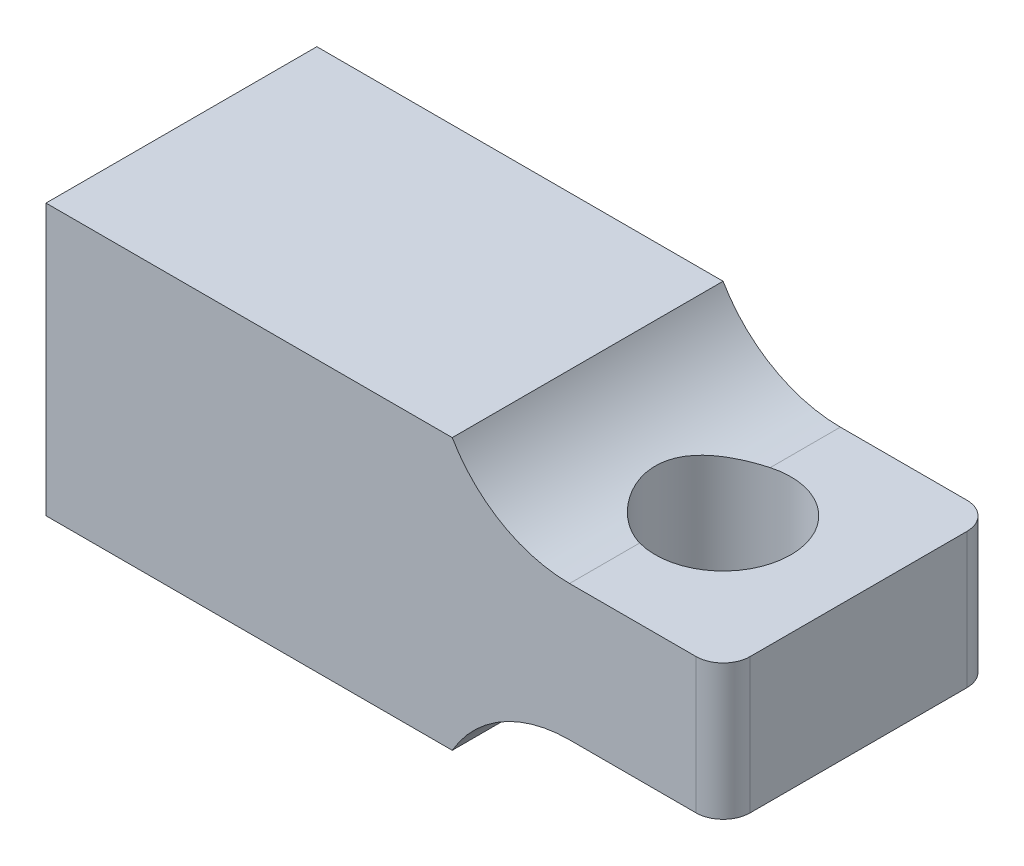
ISO-10303-21;
HEADER;
FILE_DESCRIPTION(('STEP AP214'),'2;1');
FILE_NAME('part.step','',(''),(''),'','','');
FILE_SCHEMA(('AUTOMOTIVE_DESIGN { 1 0 10303 214 1 1 1 1 }'));
ENDSEC;
DATA;
#1=APPLICATION_CONTEXT('core data for automotive mechanical design processes');
#2=APPLICATION_PROTOCOL_DEFINITION('international standard','automotive_design',2000,#1);
#3=PRODUCT_CONTEXT('',#1,'mechanical');
#4=PRODUCT('Part','Part','',(#3));
#5=PRODUCT_RELATED_PRODUCT_CATEGORY('part','',(#4));
#6=PRODUCT_DEFINITION_FORMATION('','',#4);
#7=PRODUCT_DEFINITION_CONTEXT('part definition',#1,'design');
#8=PRODUCT_DEFINITION('design','',#6,#7);
#9=PRODUCT_DEFINITION_SHAPE('','',#8);
#10=(LENGTH_UNIT() NAMED_UNIT(*) SI_UNIT(.MILLI.,.METRE.));
#11=(NAMED_UNIT(*) PLANE_ANGLE_UNIT() SI_UNIT($,.RADIAN.));
#12=(NAMED_UNIT(*) SI_UNIT($,.STERADIAN.) SOLID_ANGLE_UNIT());
#13=UNCERTAINTY_MEASURE_WITH_UNIT(LENGTH_MEASURE(1.E-05),#10,'distance_accuracy_value','');
#14=(GEOMETRIC_REPRESENTATION_CONTEXT(3) GLOBAL_UNCERTAINTY_ASSIGNED_CONTEXT((#13)) GLOBAL_UNIT_ASSIGNED_CONTEXT((#10,
#11,#12)) REPRESENTATION_CONTEXT('',''));
#15=CARTESIAN_POINT('',(0.,0.,0.));
#16=DIRECTION('',(0.,0.,1.));
#17=DIRECTION('',(1.,0.,0.));
#18=AXIS2_PLACEMENT_3D('',#15,#16,#17);
#19=CARTESIAN_POINT('',(0.,6.35,0.));
#20=DIRECTION('',(1.,0.,0.));
#21=DIRECTION('',(0.,0.,-1.));
#22=AXIS2_PLACEMENT_3D('',#19,#20,#21);
#23=PLANE('',#22);
#24=CARTESIAN_POINT('',(0.,0.,-6.35));
#25=DIRECTION('',(-1.,0.,0.));
#26=DIRECTION('',(0.,0.,1.));
#27=AXIS2_PLACEMENT_3D('',#24,#25,#26);
#28=CIRCLE('',#27,2.55269999999999);
#29=CARTESIAN_POINT('',(0.,0.,-3.79730000000001));
#30=VERTEX_POINT('',#29);
#31=EDGE_CURVE('E183',#30,#30,#28,.T.);
#32=ORIENTED_EDGE('',*,*,#31,.F.);
#33=EDGE_LOOP('',(#32));
#34=FACE_BOUND('',#33,.T.);
#35=DIRECTION('',(0.,0.,1.));
#36=VECTOR('',#35,1.);
#37=CARTESIAN_POINT('',(0.,-6.35,0.));
#38=LINE('',#37,#36);
#39=CARTESIAN_POINT('',(0.,-6.35,-12.7));
#40=VERTEX_POINT('',#39);
#41=CARTESIAN_POINT('',(0.,-6.35,0.));
#42=VERTEX_POINT('',#41);
#43=EDGE_CURVE('E152',#40,#42,#38,.T.);
#44=ORIENTED_EDGE('',*,*,#43,.T.);
#45=DIRECTION('',(0.,-1.,0.));
#46=VECTOR('',#45,1.);
#47=CARTESIAN_POINT('',(0.,6.35,0.));
#48=LINE('',#47,#46);
#49=CARTESIAN_POINT('',(0.,6.35,0.));
#50=VERTEX_POINT('',#49);
#51=EDGE_CURVE('E200',#50,#42,#48,.T.);
#52=ORIENTED_EDGE('',*,*,#51,.F.);
#53=DIRECTION('',(0.,0.,1.));
#54=VECTOR('',#53,1.);
#55=CARTESIAN_POINT('',(0.,6.35,0.));
#56=LINE('',#55,#54);
#57=CARTESIAN_POINT('',(0.,6.35,-12.7));
#58=VERTEX_POINT('',#57);
#59=EDGE_CURVE('E153',#58,#50,#56,.T.);
#60=ORIENTED_EDGE('',*,*,#59,.F.);
#61=DIRECTION('',(0.,-1.,0.));
#62=VECTOR('',#61,1.);
#63=CARTESIAN_POINT('',(0.,6.35,-12.7));
#64=LINE('',#63,#62);
#65=EDGE_CURVE('E196',#58,#40,#64,.T.);
#66=ORIENTED_EDGE('',*,*,#65,.T.);
#67=EDGE_LOOP('',(#44,#52,#60,#66));
#68=FACE_BOUND('',#67,.T.);
#69=ADVANCED_FACE('F35',(#34,#68),#23,.F.);
#70=CARTESIAN_POINT('',(0.,6.35,0.));
#71=DIRECTION('',(0.,0.,-1.));
#72=DIRECTION('',(-1.,0.,0.));
#73=AXIS2_PLACEMENT_3D('',#70,#71,#72);
#74=PLANE('',#73);
#75=DIRECTION('',(-1.,0.,0.));
#76=VECTOR('',#75,1.);
#77=CARTESIAN_POINT('',(31.75,-3.175,0.));
#78=LINE('',#77,#76);
#79=CARTESIAN_POINT('',(30.48,-3.175,0.));
#80=VERTEX_POINT('',#79);
#81=CARTESIAN_POINT('',(24.5492613140312,-3.175,0.));
#82=VERTEX_POINT('',#81);
#83=EDGE_CURVE('E170',#80,#82,#78,.T.);
#84=ORIENTED_EDGE('',*,*,#83,.F.);
#85=DIRECTION('',(0.,-1.,0.));
#86=VECTOR('',#85,1.);
#87=CARTESIAN_POINT('',(30.48,6.35,0.));
#88=LINE('',#87,#86);
#89=CARTESIAN_POINT('',(30.48,3.175,0.));
#90=VERTEX_POINT('',#89);
#91=EDGE_CURVE('E58',#80,#90,#88,.F.);
#92=ORIENTED_EDGE('',*,*,#91,.T.);
#93=DIRECTION('',(1.,0.,0.));
#94=VECTOR('',#93,1.);
#95=CARTESIAN_POINT('',(31.75,3.175,0.));
#96=LINE('',#95,#94);
#97=CARTESIAN_POINT('',(24.5492613140312,3.175,0.));
#98=VERTEX_POINT('',#97);
#99=EDGE_CURVE('E165',#98,#90,#96,.T.);
#100=ORIENTED_EDGE('',*,*,#99,.F.);
#101=CARTESIAN_POINT('',(24.5492613140312,9.525,0.));
#102=DIRECTION('',(0.,0.,-1.));
#103=DIRECTION('',(-1.,0.,0.));
#104=AXIS2_PLACEMENT_3D('',#101,#102,#103);
#105=CIRCLE('',#104,6.35);
#106=CARTESIAN_POINT('',(19.05,6.35,0.));
#107=VERTEX_POINT('',#106);
#108=EDGE_CURVE('E221',#98,#107,#105,.T.);
#109=ORIENTED_EDGE('',*,*,#108,.T.);
#110=DIRECTION('',(1.,0.,0.));
#111=VECTOR('',#110,1.);
#112=CARTESIAN_POINT('',(0.,6.35,0.));
#113=LINE('',#112,#111);
#114=EDGE_CURVE('E191',#50,#107,#113,.T.);
#115=ORIENTED_EDGE('',*,*,#114,.F.);
#116=ORIENTED_EDGE('',*,*,#51,.T.);
#117=DIRECTION('',(1.,0.,0.));
#118=VECTOR('',#117,1.);
#119=CARTESIAN_POINT('',(0.,-6.35,0.));
#120=LINE('',#119,#118);
#121=CARTESIAN_POINT('',(19.05,-6.35,0.));
#122=VERTEX_POINT('',#121);
#123=EDGE_CURVE('E154',#42,#122,#120,.T.);
#124=ORIENTED_EDGE('',*,*,#123,.T.);
#125=CARTESIAN_POINT('',(24.5492613140312,-9.525,0.));
#126=DIRECTION('',(0.,0.,-1.));
#127=DIRECTION('',(-1.,0.,0.));
#128=AXIS2_PLACEMENT_3D('',#125,#126,#127);
#129=CIRCLE('',#128,6.35);
#130=EDGE_CURVE('E160',#122,#82,#129,.T.);
#131=ORIENTED_EDGE('',*,*,#130,.T.);
#132=EDGE_LOOP('',(#84,#92,#100,#109,#115,#116,#124,#131));
#133=FACE_BOUND('',#132,.T.);
#134=ADVANCED_FACE('F262',(#133),#74,.F.);
#135=CARTESIAN_POINT('',(31.75,6.35,0.));
#136=DIRECTION('',(-1.,0.,0.));
#137=DIRECTION('',(0.,0.,1.));
#138=AXIS2_PLACEMENT_3D('',#135,#136,#137);
#139=PLANE('',#138);
#140=DIRECTION('',(0.,0.,1.));
#141=VECTOR('',#140,1.);
#142=CARTESIAN_POINT('',(31.75,3.175,-12.7));
#143=LINE('',#142,#141);
#144=CARTESIAN_POINT('',(31.75,3.175,-11.43));
#145=VERTEX_POINT('',#144);
#146=CARTESIAN_POINT('',(31.75,3.175,-1.27));
#147=VERTEX_POINT('',#146);
#148=EDGE_CURVE('E177',#145,#147,#143,.T.);
#149=ORIENTED_EDGE('',*,*,#148,.T.);
#150=DIRECTION('',(0.,-1.,0.));
#151=VECTOR('',#150,1.);
#152=CARTESIAN_POINT('',(31.75,6.35,-1.27));
#153=LINE('',#152,#151);
#154=CARTESIAN_POINT('',(31.75,-3.175,-1.27));
#155=VERTEX_POINT('',#154);
#156=EDGE_CURVE('E245',#147,#155,#153,.T.);
#157=ORIENTED_EDGE('',*,*,#156,.T.);
#158=DIRECTION('',(0.,0.,1.));
#159=VECTOR('',#158,1.);
#160=CARTESIAN_POINT('',(31.75,-3.175,-12.7));
#161=LINE('',#160,#159);
#162=CARTESIAN_POINT('',(31.75,-3.175,-11.43));
#163=VERTEX_POINT('',#162);
#164=EDGE_CURVE('E162',#163,#155,#161,.T.);
#165=ORIENTED_EDGE('',*,*,#164,.F.);
#166=DIRECTION('',(0.,-1.,0.));
#167=VECTOR('',#166,1.);
#168=CARTESIAN_POINT('',(31.75,6.35,-11.43));
#169=LINE('',#168,#167);
#170=EDGE_CURVE('E142',#163,#145,#169,.F.);
#171=ORIENTED_EDGE('',*,*,#170,.T.);
#172=EDGE_LOOP('',(#149,#157,#165,#171));
#173=FACE_BOUND('',#172,.T.);
#174=ADVANCED_FACE('F258',(#173),#139,.F.);
#175=CARTESIAN_POINT('',(0.,6.35,-12.7));
#176=DIRECTION('',(0.,0.,1.));
#177=DIRECTION('',(1.,0.,0.));
#178=AXIS2_PLACEMENT_3D('',#175,#176,#177);
#179=PLANE('',#178);
#180=DIRECTION('',(1.,0.,0.));
#181=VECTOR('',#180,1.);
#182=CARTESIAN_POINT('',(31.75,3.175,-12.7));
#183=LINE('',#182,#181);
#184=CARTESIAN_POINT('',(24.5492613140312,3.175,-12.7));
#185=VERTEX_POINT('',#184);
#186=CARTESIAN_POINT('',(30.48,3.175,-12.7));
#187=VERTEX_POINT('',#186);
#188=EDGE_CURVE('E173',#185,#187,#183,.T.);
#189=ORIENTED_EDGE('',*,*,#188,.T.);
#190=DIRECTION('',(0.,-1.,0.));
#191=VECTOR('',#190,1.);
#192=CARTESIAN_POINT('',(30.48,6.35,-12.7));
#193=LINE('',#192,#191);
#194=CARTESIAN_POINT('',(30.48,-3.175,-12.7));
#195=VERTEX_POINT('',#194);
#196=EDGE_CURVE('E11',#187,#195,#193,.T.);
#197=ORIENTED_EDGE('',*,*,#196,.T.);
#198=DIRECTION('',(-1.,0.,0.));
#199=VECTOR('',#198,1.);
#200=CARTESIAN_POINT('',(31.75,-3.175,-12.7));
#201=LINE('',#200,#199);
#202=CARTESIAN_POINT('',(24.5492613140312,-3.175,-12.7));
#203=VERTEX_POINT('',#202);
#204=EDGE_CURVE('E137',#195,#203,#201,.T.);
#205=ORIENTED_EDGE('',*,*,#204,.T.);
#206=CARTESIAN_POINT('',(24.5492613140312,-9.525,-12.7));
#207=DIRECTION('',(0.,0.,1.));
#208=DIRECTION('',(1.,0.,0.));
#209=AXIS2_PLACEMENT_3D('',#206,#207,#208);
#210=CIRCLE('',#209,6.35);
#211=CARTESIAN_POINT('',(19.05,-6.35,-12.7));
#212=VERTEX_POINT('',#211);
#213=EDGE_CURVE('E130',#203,#212,#210,.T.);
#214=ORIENTED_EDGE('',*,*,#213,.T.);
#215=DIRECTION('',(-1.,0.,0.));
#216=VECTOR('',#215,1.);
#217=CARTESIAN_POINT('',(0.,-6.35,-12.7));
#218=LINE('',#217,#216);
#219=EDGE_CURVE('E134',#212,#40,#218,.T.);
#220=ORIENTED_EDGE('',*,*,#219,.T.);
#221=ORIENTED_EDGE('',*,*,#65,.F.);
#222=DIRECTION('',(-1.,0.,0.));
#223=VECTOR('',#222,1.);
#224=CARTESIAN_POINT('',(0.,6.35,-12.7));
#225=LINE('',#224,#223);
#226=CARTESIAN_POINT('',(19.05,6.35,-12.7));
#227=VERTEX_POINT('',#226);
#228=EDGE_CURVE('E194',#227,#58,#225,.T.);
#229=ORIENTED_EDGE('',*,*,#228,.F.);
#230=CARTESIAN_POINT('',(24.5492613140312,9.525,-12.7));
#231=DIRECTION('',(0.,0.,1.));
#232=DIRECTION('',(1.,0.,0.));
#233=AXIS2_PLACEMENT_3D('',#230,#231,#232);
#234=CIRCLE('',#233,6.35);
#235=EDGE_CURVE('E263',#227,#185,#234,.T.);
#236=ORIENTED_EDGE('',*,*,#235,.T.);
#237=EDGE_LOOP('',(#189,#197,#205,#214,#220,#221,#229,#236));
#238=FACE_BOUND('',#237,.T.);
#239=ADVANCED_FACE('F132',(#238),#179,.F.);
#240=CARTESIAN_POINT('',(0.,6.35,0.));
#241=DIRECTION('',(0.,-1.,0.));
#242=DIRECTION('',(0.,0.,-1.));
#243=AXIS2_PLACEMENT_3D('',#240,#241,#242);
#244=PLANE('',#243);
#245=ORIENTED_EDGE('',*,*,#114,.T.);
#246=DIRECTION('',(0.,0.,1.));
#247=VECTOR('',#246,1.);
#248=CARTESIAN_POINT('',(19.05,6.35,-12.7));
#249=LINE('',#248,#247);
#250=EDGE_CURVE('E175',#227,#107,#249,.T.);
#251=ORIENTED_EDGE('',*,*,#250,.F.);
#252=ORIENTED_EDGE('',*,*,#228,.T.);
#253=ORIENTED_EDGE('',*,*,#59,.T.);
#254=EDGE_LOOP('',(#245,#251,#252,#253));
#255=FACE_BOUND('',#254,.T.);
#256=ADVANCED_FACE('F278',(#255),#244,.F.);
#257=CARTESIAN_POINT('',(0.,-6.35,0.));
#258=DIRECTION('',(0.,-1.,0.));
#259=DIRECTION('',(0.,0.,-1.));
#260=AXIS2_PLACEMENT_3D('',#257,#258,#259);
#261=PLANE('',#260);
#262=DIRECTION('',(0.,0.,1.));
#263=VECTOR('',#262,1.);
#264=CARTESIAN_POINT('',(19.05,-6.35,-12.7));
#265=LINE('',#264,#263);
#266=EDGE_CURVE('E149',#212,#122,#265,.T.);
#267=ORIENTED_EDGE('',*,*,#266,.T.);
#268=ORIENTED_EDGE('',*,*,#123,.F.);
#269=ORIENTED_EDGE('',*,*,#43,.F.);
#270=ORIENTED_EDGE('',*,*,#219,.F.);
#271=EDGE_LOOP('',(#267,#268,#269,#270));
#272=FACE_BOUND('',#271,.T.);
#273=ADVANCED_FACE('F148',(#272),#261,.T.);
#274=CARTESIAN_POINT('',(25.4,6.35,-6.35));
#275=DIRECTION('',(0.,1.,0.));
#276=DIRECTION('',(0.,0.,1.));
#277=AXIS2_PLACEMENT_3D('',#274,#275,#276);
#278=CYLINDRICAL_SURFACE('',#277,3.175);
#279=CARTESIAN_POINT('',(25.4,-3.175,-6.35));
#280=DIRECTION('',(0.,1.,0.));
#281=DIRECTION('',(-1.,0.,0.));
#282=AXIS2_PLACEMENT_3D('',#279,#280,#281);
#283=CIRCLE('',#282,3.175);
#284=CARTESIAN_POINT('',(24.5492613140312,-3.175,-9.40889991470725));
#285=VERTEX_POINT('',#284);
#286=CARTESIAN_POINT('',(24.5492613140312,-3.175,-3.29110008529275));
#287=VERTEX_POINT('',#286);
#288=EDGE_CURVE('E161',#285,#287,#283,.F.);
#289=ORIENTED_EDGE('',*,*,#288,.T.);
#290=CARTESIAN_POINT('',(24.5492613140312,-3.175,-3.29110008529275));
#291=CARTESIAN_POINT('',(24.4660915377249,-3.17498737835902,-3.31421818629125));
#292=CARTESIAN_POINT('',(24.3838884335345,-3.17663365343391,-3.34074714025521));
#293=CARTESIAN_POINT('',(24.222050979392,-3.18292262605166,-3.40034371766706));
#294=CARTESIAN_POINT('',(24.1424153413064,-3.18756379565462,-3.43340800094694));
#295=CARTESIAN_POINT('',(23.9865530106745,-3.19949955784596,-3.5056814797863));
#296=CARTESIAN_POINT('',(23.9103147264998,-3.20678420365704,-3.54486733061761));
#297=CARTESIAN_POINT('',(23.7614496675442,-3.22361354651064,-3.62913574616115));
#298=CARTESIAN_POINT('',(23.6888232698451,-3.23315847893077,-3.67421892477957));
#299=CARTESIAN_POINT('',(23.4772828030649,-3.26452045317134,-3.81766430863597));
#300=CARTESIAN_POINT('',(23.3443238076043,-3.28909771809974,-3.92440131353114));
#301=CARTESIAN_POINT('',(23.0974719216235,-3.3418925656655,-4.15731375756623));
#302=CARTESIAN_POINT('',(22.9835989371624,-3.37011389531052,-4.28350923116358));
#303=CARTESIAN_POINT('',(22.7720010550618,-3.42774754896076,-4.55947084311855));
#304=CARTESIAN_POINT('',(22.6754175217717,-3.45714588248046,-4.71011908300886));
#305=CARTESIAN_POINT('',(22.5086363554259,-3.51117648569634,-5.02615873893508));
#306=CARTESIAN_POINT('',(22.4384335918262,-3.53580968166599,-5.19154728052186));
#307=CARTESIAN_POINT('',(22.3267705226977,-3.57633663390289,-5.53266459837418));
#308=CARTESIAN_POINT('',(22.2852819492299,-3.59223898213241,-5.70838301982277));
#309=CARTESIAN_POINT('',(22.232701178686,-3.61256545829925,-6.06492174518888));
#310=CARTESIAN_POINT('',(22.2215920967716,-3.61699596218341,-6.24573915861386));
#311=CARTESIAN_POINT('',(22.2299531729928,-3.61371446815001,-6.59481282875962));
#312=CARTESIAN_POINT('',(22.2474955231552,-3.60676789001974,-6.76312641945819));
#313=CARTESIAN_POINT('',(22.308858423148,-3.58326989836394,-7.09419115078008));
#314=CARTESIAN_POINT('',(22.3526830267299,-3.56671700318121,-7.25694142922906));
#315=CARTESIAN_POINT('',(22.465188810223,-3.52644274976279,-7.5729982057152));
#316=CARTESIAN_POINT('',(22.5339222074891,-3.50270634980953,-7.72628406712932));
#317=CARTESIAN_POINT('',(22.6943181734342,-3.45138875122633,-8.01969603132678));
#318=CARTESIAN_POINT('',(22.7859918460961,-3.42380569353559,-8.15981571586016));
#319=CARTESIAN_POINT('',(22.9969325031502,-3.36663245872795,-8.43268685695122));
#320=CARTESIAN_POINT('',(23.1176257687448,-3.33703043625021,-8.56433419043174));
#321=CARTESIAN_POINT('',(23.3799143170688,-3.28216548810673,-8.80592691812841));
#322=CARTESIAN_POINT('',(23.5214915658434,-3.25689885901789,-8.91589084706252));
#323=CARTESIAN_POINT('',(23.7387905142293,-3.22656602623439,-9.05692650275346));
#324=CARTESIAN_POINT('',(23.8076995028921,-3.21805022818109,-9.09802813757241));
#325=CARTESIAN_POINT('',(23.9486133610222,-3.2030751999361,-9.17498438894505));
#326=CARTESIAN_POINT('',(24.0206177124472,-3.19661562712223,-9.21083987910836));
#327=CARTESIAN_POINT('',(24.1674714911162,-3.18605983380147,-9.27711502935492));
#328=CARTESIAN_POINT('',(24.2423276024495,-3.18196958270944,-9.30752082733599));
#329=CARTESIAN_POINT('',(24.3942600647104,-3.17643413760237,-9.36258361858818));
#330=CARTESIAN_POINT('',(24.4713374883042,-3.17499024400587,-9.38723778031839));
#331=CARTESIAN_POINT('',(24.5492613140312,-3.175,-9.40889991470725));
#332=B_SPLINE_CURVE_WITH_KNOTS('',3,(#290,#291,#292,#293,#294,#295,#296,#297,#298,#299,#300,
#301,#302,#303,#304,#305,#306,#307,#308,#309,#310,#311,#312,#313,#314,#315,#316,#317,#318,#319,
#320,#321,#322,#323,#324,#325,#326,#327,#328,#329,#330,#331),.UNSPECIFIED.,.F.,.F.,(4,2,2,2,2,2,
2,2,2,2,2,2,2,2,2,2,2,2,2,2,4),(0.,0.258853871429198,0.517575784692825,0.775334114991391,
1.03311929907173,1.54743156865345,2.06227695478651,2.60377926175566,3.14517620254124,
3.68603939926368,4.22660192454779,4.73226731311277,5.23801071512971,5.74482052011351,
6.25187611682297,6.79254338020317,7.33274646487418,7.57460330070347,7.81641981558596,
8.05884295730184,8.30138519370174),.UNSPECIFIED.);
#333=EDGE_CURVE('E143',#287,#285,#332,.T.);
#334=ORIENTED_EDGE('',*,*,#333,.T.);
#335=EDGE_LOOP('',(#289,#334));
#336=FACE_BOUND('',#335,.T.);
#337=CARTESIAN_POINT('',(25.4,3.175,-6.35));
#338=DIRECTION('',(0.,-1.,0.));
#339=DIRECTION('',(1.,0.,0.));
#340=AXIS2_PLACEMENT_3D('',#337,#338,#339);
#341=CIRCLE('',#340,3.175);
#342=CARTESIAN_POINT('',(24.5492613140312,3.175,-3.29110008529275));
#343=VERTEX_POINT('',#342);
#344=CARTESIAN_POINT('',(24.5492613140312,3.175,-9.40889991470725));
#345=VERTEX_POINT('',#344);
#346=EDGE_CURVE('E180',#343,#345,#341,.F.);
#347=ORIENTED_EDGE('',*,*,#346,.T.);
#348=CARTESIAN_POINT('',(24.5492613140312,3.175,-9.40889991470725));
#349=CARTESIAN_POINT('',(24.4660915377249,3.17498737835902,-9.38578181370875));
#350=CARTESIAN_POINT('',(24.3838884335345,3.17663365343391,-9.35925285974479));
#351=CARTESIAN_POINT('',(24.222050979392,3.18292262605165,-9.29965628233295));
#352=CARTESIAN_POINT('',(24.1424153413064,3.18756379565461,-9.26659199905307));
#353=CARTESIAN_POINT('',(23.9865530106745,3.19949955784596,-9.19431852021371));
#354=CARTESIAN_POINT('',(23.9103147264998,3.20678420365704,-9.15513266938239));
#355=CARTESIAN_POINT('',(23.7614496675442,3.22361354651063,-9.07086425383886));
#356=CARTESIAN_POINT('',(23.6888232698451,3.23315847893077,-9.02578107522044));
#357=CARTESIAN_POINT('',(23.4772828030649,3.26452045317133,-8.88233569136403));
#358=CARTESIAN_POINT('',(23.3443238076043,3.28909771809974,-8.77559868646887));
#359=CARTESIAN_POINT('',(23.0974719216235,3.34189256566549,-8.54268624243378));
#360=CARTESIAN_POINT('',(22.9835989371624,3.37011389531051,-8.41649076883642));
#361=CARTESIAN_POINT('',(22.7720010550618,3.42774754896076,-8.14052915688145));
#362=CARTESIAN_POINT('',(22.6754175217717,3.45714588248046,-7.98988091699115));
#363=CARTESIAN_POINT('',(22.5086363554259,3.51117648569634,-7.67384126106493));
#364=CARTESIAN_POINT('',(22.4384335918262,3.53580968166599,-7.50845271947815));
#365=CARTESIAN_POINT('',(22.3267705226977,3.57633663390289,-7.16733540162583));
#366=CARTESIAN_POINT('',(22.2852819492299,3.5922389821324,-6.99161698017724));
#367=CARTESIAN_POINT('',(22.232701178686,3.61256545829925,-6.63507825481113));
#368=CARTESIAN_POINT('',(22.2215920967716,3.61699596218341,-6.45426084138615));
#369=CARTESIAN_POINT('',(22.2299531729928,3.61371446815,-6.10518717124039));
#370=CARTESIAN_POINT('',(22.2474955231552,3.60676789001974,-5.93687358054182));
#371=CARTESIAN_POINT('',(22.308858423148,3.58326989836394,-5.60580884921993));
#372=CARTESIAN_POINT('',(22.3526830267299,3.56671700318121,-5.44305857077095));
#373=CARTESIAN_POINT('',(22.465188810223,3.52644274976279,-5.12700179428481));
#374=CARTESIAN_POINT('',(22.5339222074891,3.50270634980953,-4.97371593287069));
#375=CARTESIAN_POINT('',(22.6943181734342,3.45138875122633,-4.68030396867322));
#376=CARTESIAN_POINT('',(22.7859918460961,3.42380569353559,-4.54018428413984));
#377=CARTESIAN_POINT('',(22.9969325031502,3.36663245872795,-4.26731314304879));
#378=CARTESIAN_POINT('',(23.1176257687448,3.33703043625021,-4.13566580956827));
#379=CARTESIAN_POINT('',(23.3799143170687,3.28216548810673,-3.8940730818716));
#380=CARTESIAN_POINT('',(23.5214915658434,3.25689885901789,-3.78410915293749));
#381=CARTESIAN_POINT('',(23.7387905142293,3.22656602623439,-3.64307349724654));
#382=CARTESIAN_POINT('',(23.8076995028921,3.21805022818109,-3.6019718624276));
#383=CARTESIAN_POINT('',(23.9486133610221,3.2030751999361,-3.52501561105495));
#384=CARTESIAN_POINT('',(24.0206177124472,3.19661562712222,-3.48916012089164));
#385=CARTESIAN_POINT('',(24.1674714911162,3.18605983380146,-3.42288497064508));
#386=CARTESIAN_POINT('',(24.2423276024495,3.18196958270944,-3.39247917266401));
#387=CARTESIAN_POINT('',(24.3942600647104,3.17643413760237,-3.33741638141181));
#388=CARTESIAN_POINT('',(24.4713374883042,3.17499024400586,-3.3127622196816));
#389=CARTESIAN_POINT('',(24.5492613140312,3.175,-3.29110008529275));
#390=B_SPLINE_CURVE_WITH_KNOTS('',3,(#348,#349,#350,#351,#352,#353,#354,#355,#356,#357,#358,
#359,#360,#361,#362,#363,#364,#365,#366,#367,#368,#369,#370,#371,#372,#373,#374,#375,#376,#377,
#378,#379,#380,#381,#382,#383,#384,#385,#386,#387,#388,#389),.UNSPECIFIED.,.F.,.F.,(4,2,2,2,2,2,
2,2,2,2,2,2,2,2,2,2,2,2,2,2,4),(0.,0.258853871429194,0.517575784692821,0.775334114991387,
1.03311929907173,1.54743156865345,2.0622769547865,2.60377926175566,3.14517620254123,
3.68603939926367,4.22660192454778,4.73226731311277,5.23801071512971,5.7448205201135,
6.25187611682296,6.79254338020317,7.33274646487418,7.57460330070346,7.81641981558596,
8.05884295730185,8.30138519370175),.UNSPECIFIED.);
#391=EDGE_CURVE('E214',#345,#343,#390,.T.);
#392=ORIENTED_EDGE('',*,*,#391,.T.);
#393=EDGE_LOOP('',(#347,#392));
#394=FACE_BOUND('',#393,.T.);
#395=ADVANCED_FACE('F223',(#336,#394),#278,.F.);
#396=CARTESIAN_POINT('',(12.7,0.,-6.35000000000001));
#397=DIRECTION('',(-1.,0.,0.));
#398=DIRECTION('',(0.,0.,1.));
#399=AXIS2_PLACEMENT_3D('',#396,#397,#398);
#400=CONICAL_SURFACE('',#399,2.5527,1.02974425867665);
#401=CARTESIAN_POINT('',(14.2338169021916,0.,-6.35000000000001));
#402=VERTEX_POINT('',#401);
#403=VERTEX_LOOP('',#402);
#404=FACE_BOUND('',#403,.T.);
#405=CARTESIAN_POINT('',(12.7,0.,-6.35000000000001));
#406=DIRECTION('',(-1.,0.,0.));
#407=DIRECTION('',(0.,0.,1.));
#408=AXIS2_PLACEMENT_3D('',#405,#406,#407);
#409=CIRCLE('',#408,2.5527);
#410=CARTESIAN_POINT('',(12.7,0.,-3.79730000000001));
#411=VERTEX_POINT('',#410);
#412=EDGE_CURVE('E186',#411,#411,#409,.T.);
#413=ORIENTED_EDGE('',*,*,#412,.T.);
#414=EDGE_LOOP('',(#413));
#415=FACE_BOUND('',#414,.T.);
#416=ADVANCED_FACE('F268',(#404,#415),#400,.F.);
#417=CARTESIAN_POINT('',(0.,0.,-6.35));
#418=DIRECTION('',(-1.,0.,0.));
#419=DIRECTION('',(0.,0.,1.));
#420=AXIS2_PLACEMENT_3D('',#417,#418,#419);
#421=CYLINDRICAL_SURFACE('',#420,2.55269999999999);
#422=ORIENTED_EDGE('',*,*,#412,.F.);
#423=EDGE_LOOP('',(#422));
#424=FACE_BOUND('',#423,.T.);
#425=ORIENTED_EDGE('',*,*,#31,.T.);
#426=EDGE_LOOP('',(#425));
#427=FACE_BOUND('',#426,.T.);
#428=ADVANCED_FACE('F288',(#424,#427),#421,.F.);
#429=CARTESIAN_POINT('',(31.75,3.175,-12.7));
#430=DIRECTION('',(0.,-1.,0.));
#431=DIRECTION('',(1.,0.,0.));
#432=AXIS2_PLACEMENT_3D('',#429,#430,#431);
#433=PLANE('',#432);
#434=ORIENTED_EDGE('',*,*,#99,.T.);
#435=CARTESIAN_POINT('',(30.48,3.175,-1.27));
#436=DIRECTION('',(0.,-1.,0.));
#437=DIRECTION('',(1.,0.,0.));
#438=AXIS2_PLACEMENT_3D('',#435,#436,#437);
#439=CIRCLE('',#438,1.27);
#440=EDGE_CURVE('E43',#90,#147,#439,.F.);
#441=ORIENTED_EDGE('',*,*,#440,.T.);
#442=ORIENTED_EDGE('',*,*,#148,.F.);
#443=CARTESIAN_POINT('',(30.48,3.175,-11.43));
#444=DIRECTION('',(0.,-1.,0.));
#445=DIRECTION('',(1.,0.,0.));
#446=AXIS2_PLACEMENT_3D('',#443,#444,#445);
#447=CIRCLE('',#446,1.27);
#448=EDGE_CURVE('E50',#145,#187,#447,.F.);
#449=ORIENTED_EDGE('',*,*,#448,.T.);
#450=ORIENTED_EDGE('',*,*,#188,.F.);
#451=DIRECTION('',(0.,0.,1.));
#452=VECTOR('',#451,1.);
#453=CARTESIAN_POINT('',(24.5492613140312,3.175,-12.7));
#454=LINE('',#453,#452);
#455=EDGE_CURVE('E207',#185,#345,#454,.T.);
#456=ORIENTED_EDGE('',*,*,#455,.T.);
#457=ORIENTED_EDGE('',*,*,#346,.F.);
#458=DIRECTION('',(0.,0.,1.));
#459=VECTOR('',#458,1.);
#460=CARTESIAN_POINT('',(24.5492613140312,3.175,-12.7));
#461=LINE('',#460,#459);
#462=EDGE_CURVE('E203',#343,#98,#461,.T.);
#463=ORIENTED_EDGE('',*,*,#462,.T.);
#464=EDGE_LOOP('',(#434,#441,#442,#449,#450,#456,#457,#463));
#465=FACE_BOUND('',#464,.T.);
#466=ADVANCED_FACE('F254',(#465),#433,.F.);
#467=CARTESIAN_POINT('',(31.75,-3.175,-12.7));
#468=DIRECTION('',(0.,1.,0.));
#469=DIRECTION('',(-1.,0.,0.));
#470=AXIS2_PLACEMENT_3D('',#467,#468,#469);
#471=PLANE('',#470);
#472=ORIENTED_EDGE('',*,*,#164,.T.);
#473=CARTESIAN_POINT('',(30.48,-3.175,-1.27));
#474=DIRECTION('',(0.,1.,0.));
#475=DIRECTION('',(-1.,0.,0.));
#476=AXIS2_PLACEMENT_3D('',#473,#474,#475);
#477=CIRCLE('',#476,1.27);
#478=EDGE_CURVE('E250',#155,#80,#477,.F.);
#479=ORIENTED_EDGE('',*,*,#478,.T.);
#480=ORIENTED_EDGE('',*,*,#83,.T.);
#481=DIRECTION('',(0.,0.,1.));
#482=VECTOR('',#481,1.);
#483=CARTESIAN_POINT('',(24.5492613140312,-3.175,-12.7));
#484=LINE('',#483,#482);
#485=EDGE_CURVE('E212',#82,#287,#484,.F.);
#486=ORIENTED_EDGE('',*,*,#485,.T.);
#487=ORIENTED_EDGE('',*,*,#288,.F.);
#488=DIRECTION('',(0.,0.,1.));
#489=VECTOR('',#488,1.);
#490=CARTESIAN_POINT('',(24.5492613140312,-3.175,-12.7));
#491=LINE('',#490,#489);
#492=EDGE_CURVE('E210',#285,#203,#491,.F.);
#493=ORIENTED_EDGE('',*,*,#492,.T.);
#494=ORIENTED_EDGE('',*,*,#204,.F.);
#495=CARTESIAN_POINT('',(30.48,-3.175,-11.43));
#496=DIRECTION('',(0.,1.,0.));
#497=DIRECTION('',(-1.,0.,0.));
#498=AXIS2_PLACEMENT_3D('',#495,#496,#497);
#499=CIRCLE('',#498,1.27);
#500=EDGE_CURVE('E248',#195,#163,#499,.F.);
#501=ORIENTED_EDGE('',*,*,#500,.T.);
#502=EDGE_LOOP('',(#472,#479,#480,#486,#487,#493,#494,#501));
#503=FACE_BOUND('',#502,.T.);
#504=ADVANCED_FACE('F232',(#503),#471,.F.);
#505=CARTESIAN_POINT('',(24.5492613140312,9.525,-12.7));
#506=DIRECTION('',(0.,0.,1.));
#507=DIRECTION('',(1.,0.,0.));
#508=AXIS2_PLACEMENT_3D('',#505,#506,#507);
#509=CYLINDRICAL_SURFACE('',#508,6.35);
#510=ORIENTED_EDGE('',*,*,#235,.F.);
#511=ORIENTED_EDGE('',*,*,#250,.T.);
#512=ORIENTED_EDGE('',*,*,#108,.F.);
#513=ORIENTED_EDGE('',*,*,#462,.F.);
#514=ORIENTED_EDGE('',*,*,#391,.F.);
#515=ORIENTED_EDGE('',*,*,#455,.F.);
#516=EDGE_LOOP('',(#510,#511,#512,#513,#514,#515));
#517=FACE_BOUND('',#516,.T.);
#518=ADVANCED_FACE('F227',(#517),#509,.F.);
#519=CARTESIAN_POINT('',(24.5492613140312,-9.525,-12.7));
#520=DIRECTION('',(0.,0.,1.));
#521=DIRECTION('',(1.,0.,0.));
#522=AXIS2_PLACEMENT_3D('',#519,#520,#521);
#523=CYLINDRICAL_SURFACE('',#522,6.35);
#524=ORIENTED_EDGE('',*,*,#333,.F.);
#525=ORIENTED_EDGE('',*,*,#485,.F.);
#526=ORIENTED_EDGE('',*,*,#130,.F.);
#527=ORIENTED_EDGE('',*,*,#266,.F.);
#528=ORIENTED_EDGE('',*,*,#213,.F.);
#529=ORIENTED_EDGE('',*,*,#492,.F.);
#530=EDGE_LOOP('',(#524,#525,#526,#527,#528,#529));
#531=FACE_BOUND('',#530,.T.);
#532=ADVANCED_FACE('F157',(#531),#523,.F.);
#533=CARTESIAN_POINT('',(30.48,6.35,-1.27));
#534=DIRECTION('',(0.,-1.,0.));
#535=DIRECTION('',(0.,0.,-1.));
#536=AXIS2_PLACEMENT_3D('',#533,#534,#535);
#537=CYLINDRICAL_SURFACE('',#536,1.27);
#538=ORIENTED_EDGE('',*,*,#440,.F.);
#539=ORIENTED_EDGE('',*,*,#91,.F.);
#540=ORIENTED_EDGE('',*,*,#478,.F.);
#541=ORIENTED_EDGE('',*,*,#156,.F.);
#542=EDGE_LOOP('',(#538,#539,#540,#541));
#543=FACE_BOUND('',#542,.T.);
#544=ADVANCED_FACE('F237',(#543),#537,.T.);
#545=CARTESIAN_POINT('',(30.48,6.35,-11.43));
#546=DIRECTION('',(0.,-1.,0.));
#547=DIRECTION('',(0.,0.,-1.));
#548=AXIS2_PLACEMENT_3D('',#545,#546,#547);
#549=CYLINDRICAL_SURFACE('',#548,1.27);
#550=ORIENTED_EDGE('',*,*,#448,.F.);
#551=ORIENTED_EDGE('',*,*,#170,.F.);
#552=ORIENTED_EDGE('',*,*,#500,.F.);
#553=ORIENTED_EDGE('',*,*,#196,.F.);
#554=EDGE_LOOP('',(#550,#551,#552,#553));
#555=FACE_BOUND('',#554,.T.);
#556=ADVANCED_FACE('F37',(#555),#549,.T.);
#557=CLOSED_SHELL('',(#69,#134,#174,#239,#256,#273,#395,#416,#428,#466,#504,#518,#532,#544,#556));
#558=MANIFOLD_SOLID_BREP('B2',#557);
#559=ADVANCED_BREP_SHAPE_REPRESENTATION('',(#18,#558),#14);
#560=SHAPE_DEFINITION_REPRESENTATION(#9,#559);
ENDSEC;
END-ISO-10303-21;
